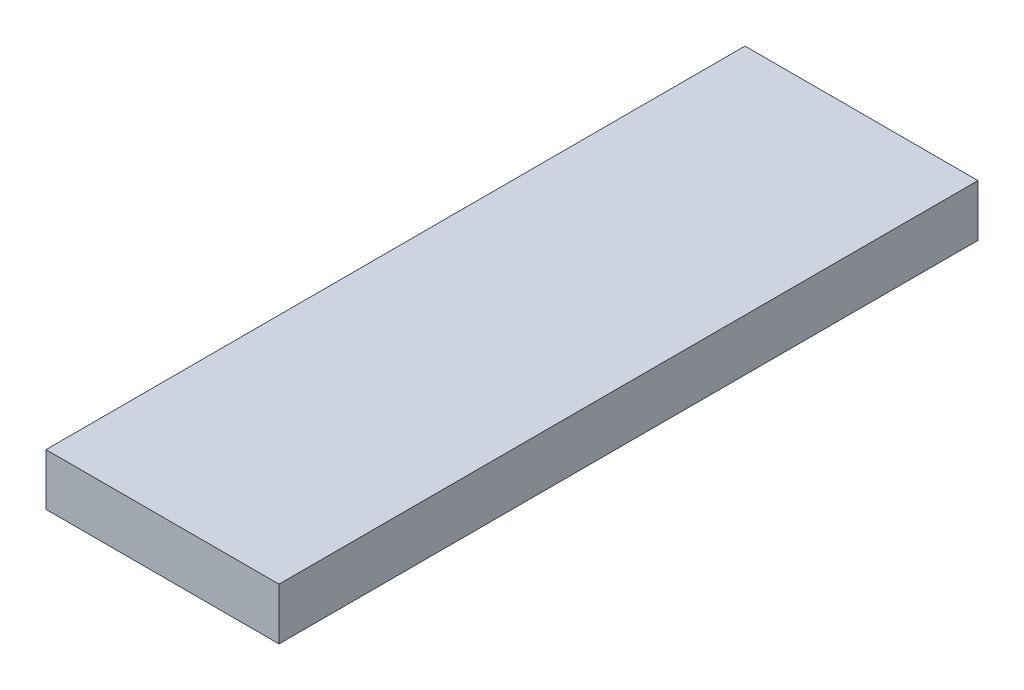
ISO-10303-21;
HEADER;
FILE_DESCRIPTION(('STEP AP214'),'2;1');
FILE_NAME('part.step','',(''),(''),'','','');
FILE_SCHEMA(('AUTOMOTIVE_DESIGN { 1 0 10303 214 1 1 1 1 }'));
ENDSEC;
DATA;
#1=APPLICATION_CONTEXT('core data for automotive mechanical design processes');
#2=APPLICATION_PROTOCOL_DEFINITION('international standard','automotive_design',2000,#1);
#3=PRODUCT_CONTEXT('',#1,'mechanical');
#4=PRODUCT('Part','Part','',(#3));
#5=PRODUCT_RELATED_PRODUCT_CATEGORY('part','',(#4));
#6=PRODUCT_DEFINITION_FORMATION('','',#4);
#7=PRODUCT_DEFINITION_CONTEXT('part definition',#1,'design');
#8=PRODUCT_DEFINITION('design','',#6,#7);
#9=PRODUCT_DEFINITION_SHAPE('','',#8);
#10=(LENGTH_UNIT() NAMED_UNIT(*) SI_UNIT(.MILLI.,.METRE.));
#11=(NAMED_UNIT(*) PLANE_ANGLE_UNIT() SI_UNIT($,.RADIAN.));
#12=(NAMED_UNIT(*) SI_UNIT($,.STERADIAN.) SOLID_ANGLE_UNIT());
#13=UNCERTAINTY_MEASURE_WITH_UNIT(LENGTH_MEASURE(1.E-05),#10,'distance_accuracy_value','');
#14=(GEOMETRIC_REPRESENTATION_CONTEXT(3) GLOBAL_UNCERTAINTY_ASSIGNED_CONTEXT((#13)) GLOBAL_UNIT_ASSIGNED_CONTEXT((#10,
#11,#12)) REPRESENTATION_CONTEXT('',''));
#15=CARTESIAN_POINT('',(0.,0.,0.));
#16=DIRECTION('',(0.,0.,1.));
#17=DIRECTION('',(1.,0.,0.));
#18=AXIS2_PLACEMENT_3D('',#15,#16,#17);
#19=CARTESIAN_POINT('',(-4.5,2.,13.5));
#20=DIRECTION('',(1.,0.,0.));
#21=DIRECTION('',(0.,0.,-1.));
#22=AXIS2_PLACEMENT_3D('',#19,#20,#21);
#23=PLANE('',#22);
#24=DIRECTION('',(0.,0.,1.));
#25=VECTOR('',#24,1.);
#26=CARTESIAN_POINT('',(-4.5,0.,13.5));
#27=LINE('',#26,#25);
#28=CARTESIAN_POINT('',(-4.5,0.,-13.5));
#29=VERTEX_POINT('',#28);
#30=CARTESIAN_POINT('',(-4.5,0.,13.5));
#31=VERTEX_POINT('',#30);
#32=EDGE_CURVE('E96',#29,#31,#27,.T.);
#33=ORIENTED_EDGE('',*,*,#32,.T.);
#34=DIRECTION('',(0.,-1.,0.));
#35=VECTOR('',#34,1.);
#36=CARTESIAN_POINT('',(-4.5,2.,13.5));
#37=LINE('',#36,#35);
#38=CARTESIAN_POINT('',(-4.5,2.,13.5));
#39=VERTEX_POINT('',#38);
#40=EDGE_CURVE('E11',#39,#31,#37,.T.);
#41=ORIENTED_EDGE('',*,*,#40,.F.);
#42=DIRECTION('',(0.,0.,1.));
#43=VECTOR('',#42,1.);
#44=CARTESIAN_POINT('',(-4.5,2.,13.5));
#45=LINE('',#44,#43);
#46=CARTESIAN_POINT('',(-4.5,2.,-13.5));
#47=VERTEX_POINT('',#46);
#48=EDGE_CURVE('E84',#47,#39,#45,.T.);
#49=ORIENTED_EDGE('',*,*,#48,.F.);
#50=DIRECTION('',(0.,-1.,0.));
#51=VECTOR('',#50,1.);
#52=CARTESIAN_POINT('',(-4.5,2.,-13.5));
#53=LINE('',#52,#51);
#54=EDGE_CURVE('E92',#47,#29,#53,.T.);
#55=ORIENTED_EDGE('',*,*,#54,.T.);
#56=EDGE_LOOP('',(#33,#41,#49,#55));
#57=FACE_BOUND('',#56,.T.);
#58=ADVANCED_FACE('F33',(#57),#23,.F.);
#59=CARTESIAN_POINT('',(4.5,2.,13.5));
#60=DIRECTION('',(0.,0.,-1.));
#61=DIRECTION('',(-1.,0.,0.));
#62=AXIS2_PLACEMENT_3D('',#59,#60,#61);
#63=PLANE('',#62);
#64=DIRECTION('',(1.,0.,0.));
#65=VECTOR('',#64,1.);
#66=CARTESIAN_POINT('',(4.5,0.,13.5));
#67=LINE('',#66,#65);
#68=CARTESIAN_POINT('',(4.5,0.,13.5));
#69=VERTEX_POINT('',#68);
#70=EDGE_CURVE('E88',#31,#69,#67,.T.);
#71=ORIENTED_EDGE('',*,*,#70,.T.);
#72=DIRECTION('',(0.,-1.,0.));
#73=VECTOR('',#72,1.);
#74=CARTESIAN_POINT('',(4.5,2.,13.5));
#75=LINE('',#74,#73);
#76=CARTESIAN_POINT('',(4.5,2.,13.5));
#77=VERTEX_POINT('',#76);
#78=EDGE_CURVE('E41',#77,#69,#75,.T.);
#79=ORIENTED_EDGE('',*,*,#78,.F.);
#80=DIRECTION('',(1.,0.,0.));
#81=VECTOR('',#80,1.);
#82=CARTESIAN_POINT('',(4.5,2.,13.5));
#83=LINE('',#82,#81);
#84=EDGE_CURVE('E79',#39,#77,#83,.T.);
#85=ORIENTED_EDGE('',*,*,#84,.F.);
#86=ORIENTED_EDGE('',*,*,#40,.T.);
#87=EDGE_LOOP('',(#71,#79,#85,#86));
#88=FACE_BOUND('',#87,.T.);
#89=ADVANCED_FACE('F87',(#88),#63,.F.);
#90=CARTESIAN_POINT('',(4.5,2.,13.5));
#91=DIRECTION('',(-1.,0.,0.));
#92=DIRECTION('',(0.,0.,1.));
#93=AXIS2_PLACEMENT_3D('',#90,#91,#92);
#94=PLANE('',#93);
#95=DIRECTION('',(0.,0.,-1.));
#96=VECTOR('',#95,1.);
#97=CARTESIAN_POINT('',(4.5,0.,13.5));
#98=LINE('',#97,#96);
#99=CARTESIAN_POINT('',(4.5,0.,-13.5));
#100=VERTEX_POINT('',#99);
#101=EDGE_CURVE('E66',#69,#100,#98,.T.);
#102=ORIENTED_EDGE('',*,*,#101,.T.);
#103=DIRECTION('',(0.,-1.,0.));
#104=VECTOR('',#103,1.);
#105=CARTESIAN_POINT('',(4.5,2.,-13.5));
#106=LINE('',#105,#104);
#107=CARTESIAN_POINT('',(4.5,2.,-13.5));
#108=VERTEX_POINT('',#107);
#109=EDGE_CURVE('E89',#108,#100,#106,.T.);
#110=ORIENTED_EDGE('',*,*,#109,.F.);
#111=DIRECTION('',(0.,0.,-1.));
#112=VECTOR('',#111,1.);
#113=CARTESIAN_POINT('',(4.5,2.,13.5));
#114=LINE('',#113,#112);
#115=EDGE_CURVE('E82',#77,#108,#114,.T.);
#116=ORIENTED_EDGE('',*,*,#115,.F.);
#117=ORIENTED_EDGE('',*,*,#78,.T.);
#118=EDGE_LOOP('',(#102,#110,#116,#117));
#119=FACE_BOUND('',#118,.T.);
#120=ADVANCED_FACE('F90',(#119),#94,.F.);
#121=CARTESIAN_POINT('',(4.5,2.,-13.5));
#122=DIRECTION('',(0.,0.,1.));
#123=DIRECTION('',(1.,0.,0.));
#124=AXIS2_PLACEMENT_3D('',#121,#122,#123);
#125=PLANE('',#124);
#126=DIRECTION('',(-1.,0.,0.));
#127=VECTOR('',#126,1.);
#128=CARTESIAN_POINT('',(4.5,0.,-13.5));
#129=LINE('',#128,#127);
#130=EDGE_CURVE('E72',#100,#29,#129,.T.);
#131=ORIENTED_EDGE('',*,*,#130,.T.);
#132=ORIENTED_EDGE('',*,*,#54,.F.);
#133=DIRECTION('',(-1.,0.,0.));
#134=VECTOR('',#133,1.);
#135=CARTESIAN_POINT('',(4.5,2.,-13.5));
#136=LINE('',#135,#134);
#137=EDGE_CURVE('E49',#108,#47,#136,.T.);
#138=ORIENTED_EDGE('',*,*,#137,.F.);
#139=ORIENTED_EDGE('',*,*,#109,.T.);
#140=EDGE_LOOP('',(#131,#132,#138,#139));
#141=FACE_BOUND('',#140,.T.);
#142=ADVANCED_FACE('F103',(#141),#125,.F.);
#143=CARTESIAN_POINT('',(0.,2.,0.));
#144=DIRECTION('',(0.,1.,0.));
#145=DIRECTION('',(0.,0.,1.));
#146=AXIS2_PLACEMENT_3D('',#143,#144,#145);
#147=PLANE('',#146);
#148=ORIENTED_EDGE('',*,*,#48,.T.);
#149=ORIENTED_EDGE('',*,*,#84,.T.);
#150=ORIENTED_EDGE('',*,*,#115,.T.);
#151=ORIENTED_EDGE('',*,*,#137,.T.);
#152=EDGE_LOOP('',(#148,#149,#150,#151));
#153=FACE_BOUND('',#152,.T.);
#154=ADVANCED_FACE('F80',(#153),#147,.T.);
#155=CARTESIAN_POINT('',(0.,0.,0.));
#156=DIRECTION('',(0.,1.,0.));
#157=DIRECTION('',(0.,0.,1.));
#158=AXIS2_PLACEMENT_3D('',#155,#156,#157);
#159=PLANE('',#158);
#160=ORIENTED_EDGE('',*,*,#32,.F.);
#161=ORIENTED_EDGE('',*,*,#130,.F.);
#162=ORIENTED_EDGE('',*,*,#101,.F.);
#163=ORIENTED_EDGE('',*,*,#70,.F.);
#164=EDGE_LOOP('',(#160,#161,#162,#163));
#165=FACE_BOUND('',#164,.T.);
#166=ADVANCED_FACE('F106',(#165),#159,.F.);
#167=CLOSED_SHELL('',(#58,#89,#120,#142,#154,#166));
#168=MANIFOLD_SOLID_BREP('B2',#167);
#169=ADVANCED_BREP_SHAPE_REPRESENTATION('',(#18,#168),#14);
#170=SHAPE_DEFINITION_REPRESENTATION(#9,#169);
ENDSEC;
END-ISO-10303-21;
